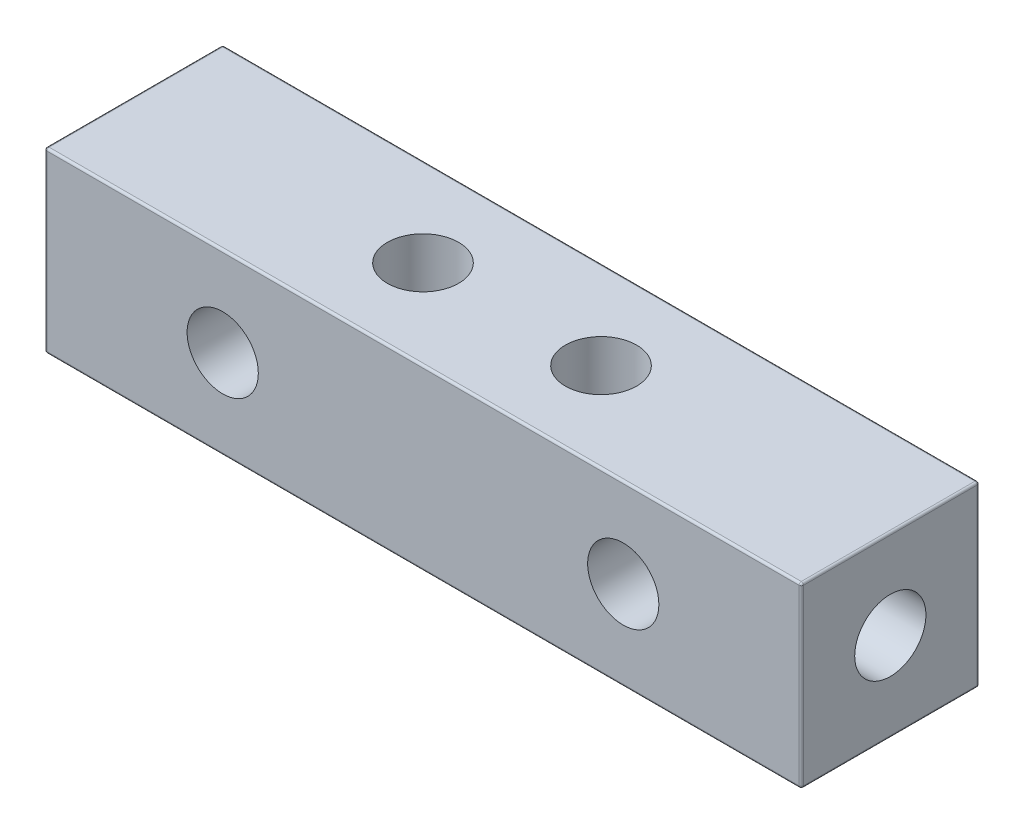
ISO-10303-21;
HEADER;
FILE_DESCRIPTION(('STEP AP214'),'2;1');
FILE_NAME('part.step','',(''),(''),'','','');
FILE_SCHEMA(('AUTOMOTIVE_DESIGN { 1 0 10303 214 1 1 1 1 }'));
ENDSEC;
DATA;
#1=APPLICATION_CONTEXT('core data for automotive mechanical design processes');
#2=APPLICATION_PROTOCOL_DEFINITION('international standard','automotive_design',2000,#1);
#3=PRODUCT_CONTEXT('',#1,'mechanical');
#4=PRODUCT('Part','Part','',(#3));
#5=PRODUCT_RELATED_PRODUCT_CATEGORY('part','',(#4));
#6=PRODUCT_DEFINITION_FORMATION('','',#4);
#7=PRODUCT_DEFINITION_CONTEXT('part definition',#1,'design');
#8=PRODUCT_DEFINITION('design','',#6,#7);
#9=PRODUCT_DEFINITION_SHAPE('','',#8);
#10=(LENGTH_UNIT() NAMED_UNIT(*) SI_UNIT(.MILLI.,.METRE.));
#11=(NAMED_UNIT(*) PLANE_ANGLE_UNIT() SI_UNIT($,.RADIAN.));
#12=(NAMED_UNIT(*) SI_UNIT($,.STERADIAN.) SOLID_ANGLE_UNIT());
#13=UNCERTAINTY_MEASURE_WITH_UNIT(LENGTH_MEASURE(1.E-05),#10,'distance_accuracy_value','');
#14=(GEOMETRIC_REPRESENTATION_CONTEXT(3) GLOBAL_UNCERTAINTY_ASSIGNED_CONTEXT((#13)) GLOBAL_UNIT_ASSIGNED_CONTEXT((#10,
#11,#12)) REPRESENTATION_CONTEXT('',''));
#15=CARTESIAN_POINT('',(0.,0.,0.));
#16=DIRECTION('',(0.,0.,1.));
#17=DIRECTION('',(1.,0.,0.));
#18=AXIS2_PLACEMENT_3D('',#15,#16,#17);
#19=CARTESIAN_POINT('',(34.,0.,0.));
#20=DIRECTION('',(-1.,0.,0.));
#21=DIRECTION('',(0.,0.,1.));
#22=AXIS2_PLACEMENT_3D('',#19,#20,#21);
#23=CYLINDRICAL_SURFACE('',#22,1.6);
#24=CARTESIAN_POINT('',(8.,0.,0.));
#25=DIRECTION('',(-0.707106781186547,0.,-0.707106781186547));
#26=DIRECTION('',(-0.707106781186547,0.,0.707106781186547));
#27=AXIS2_PLACEMENT_3D('',#24,#25,#26);
#28=ELLIPSE('',#27,2.26274169979695,1.6);
#29=CARTESIAN_POINT('',(8.,1.6,0.));
#30=VERTEX_POINT('',#29);
#31=CARTESIAN_POINT('',(8.,-1.6,0.));
#32=VERTEX_POINT('',#31);
#33=EDGE_CURVE('E239',#30,#32,#28,.T.);
#34=ORIENTED_EDGE('',*,*,#33,.T.);
#35=CARTESIAN_POINT('',(8.,0.,0.));
#36=DIRECTION('',(-0.707106781186547,0.,0.707106781186547));
#37=DIRECTION('',(-0.707106781186547,0.,-0.707106781186547));
#38=AXIS2_PLACEMENT_3D('',#35,#36,#37);
#39=ELLIPSE('',#38,2.26274169979695,1.6);
#40=EDGE_CURVE('E242',#32,#30,#39,.T.);
#41=ORIENTED_EDGE('',*,*,#40,.T.);
#42=EDGE_LOOP('',(#34,#41));
#43=FACE_BOUND('',#42,.T.);
#44=CARTESIAN_POINT('',(13.,0.,0.));
#45=DIRECTION('',(-0.707106781186547,-0.707106781186547,0.));
#46=DIRECTION('',(-0.707106781186547,0.707106781186547,0.));
#47=AXIS2_PLACEMENT_3D('',#44,#45,#46);
#48=ELLIPSE('',#47,2.26274169979695,1.6);
#49=CARTESIAN_POINT('',(13.,0.,-1.6));
#50=VERTEX_POINT('',#49);
#51=CARTESIAN_POINT('',(13.,0.,1.6));
#52=VERTEX_POINT('',#51);
#53=EDGE_CURVE('E60',#50,#52,#48,.F.);
#54=ORIENTED_EDGE('',*,*,#53,.T.);
#55=CARTESIAN_POINT('',(13.,0.,0.));
#56=DIRECTION('',(-0.707106781186547,0.707106781186547,0.));
#57=DIRECTION('',(-0.707106781186547,-0.707106781186547,0.));
#58=AXIS2_PLACEMENT_3D('',#55,#56,#57);
#59=ELLIPSE('',#58,2.26274169979695,1.6);
#60=EDGE_CURVE('E156',#52,#50,#59,.F.);
#61=ORIENTED_EDGE('',*,*,#60,.T.);
#62=EDGE_LOOP('',(#54,#61));
#63=FACE_BOUND('',#62,.T.);
#64=ADVANCED_FACE('F40',(#43,#63),#23,.F.);
#65=CARTESIAN_POINT('',(0.,0.,0.));
#66=DIRECTION('',(-1.,0.,0.));
#67=DIRECTION('',(0.,0.,1.));
#68=AXIS2_PLACEMENT_3D('',#65,#66,#67);
#69=CIRCLE('',#68,1.6);
#70=CARTESIAN_POINT('',(0.,0.,1.6));
#71=VERTEX_POINT('',#70);
#72=EDGE_CURVE('E231',#71,#71,#69,.T.);
#73=ORIENTED_EDGE('',*,*,#72,.T.);
#74=EDGE_LOOP('',(#73));
#75=FACE_BOUND('',#74,.T.);
#76=CARTESIAN_POINT('',(8.,0.,0.));
#77=DIRECTION('',(-0.707106781186547,0.,-0.707106781186547));
#78=DIRECTION('',(-0.707106781186547,0.,0.707106781186547));
#79=AXIS2_PLACEMENT_3D('',#76,#77,#78);
#80=ELLIPSE('',#79,2.26274169979695,1.6);
#81=EDGE_CURVE('E234',#30,#32,#80,.F.);
#82=ORIENTED_EDGE('',*,*,#81,.T.);
#83=CARTESIAN_POINT('',(8.,0.,0.));
#84=DIRECTION('',(-0.707106781186547,0.,0.707106781186547));
#85=DIRECTION('',(-0.707106781186547,0.,-0.707106781186547));
#86=AXIS2_PLACEMENT_3D('',#83,#84,#85);
#87=ELLIPSE('',#86,2.26274169979695,1.6);
#88=EDGE_CURVE('E163',#32,#30,#87,.F.);
#89=ORIENTED_EDGE('',*,*,#88,.T.);
#90=EDGE_LOOP('',(#82,#89));
#91=FACE_BOUND('',#90,.T.);
#92=ADVANCED_FACE('F194',(#75,#91),#23,.F.);
#93=CARTESIAN_POINT('',(34.,4.,-4.));
#94=DIRECTION('',(0.,0.,1.));
#95=DIRECTION('',(0.,-1.,0.));
#96=AXIS2_PLACEMENT_3D('',#93,#94,#95);
#97=PLANE('',#96);
#98=CARTESIAN_POINT('',(8.,0.,-4.));
#99=DIRECTION('',(0.,0.,1.));
#100=DIRECTION('',(1.,0.,0.));
#101=AXIS2_PLACEMENT_3D('',#98,#99,#100);
#102=CIRCLE('',#101,1.6);
#103=CARTESIAN_POINT('',(9.6,0.,-4.));
#104=VERTEX_POINT('',#103);
#105=EDGE_CURVE('E381',#104,#104,#102,.T.);
#106=ORIENTED_EDGE('',*,*,#105,.T.);
#107=EDGE_LOOP('',(#106));
#108=FACE_BOUND('',#107,.T.);
#109=CARTESIAN_POINT('',(26.,0.,-4.));
#110=DIRECTION('',(0.,0.,1.));
#111=DIRECTION('',(1.,0.,0.));
#112=AXIS2_PLACEMENT_3D('',#109,#110,#111);
#113=CIRCLE('',#112,1.6);
#114=CARTESIAN_POINT('',(27.6,0.,-4.));
#115=VERTEX_POINT('',#114);
#116=EDGE_CURVE('E384',#115,#115,#113,.T.);
#117=ORIENTED_EDGE('',*,*,#116,.T.);
#118=EDGE_LOOP('',(#117));
#119=FACE_BOUND('',#118,.T.);
#120=DIRECTION('',(0.,1.,0.));
#121=VECTOR('',#120,1.);
#122=CARTESIAN_POINT('',(33.9,-4.,-4.));
#123=LINE('',#122,#121);
#124=CARTESIAN_POINT('',(33.9,3.9,-4.));
#125=VERTEX_POINT('',#124);
#126=CARTESIAN_POINT('',(33.9,-3.9,-4.));
#127=VERTEX_POINT('',#126);
#128=EDGE_CURVE('E352',#125,#127,#123,.F.);
#129=ORIENTED_EDGE('',*,*,#128,.T.);
#130=DIRECTION('',(-1.,0.,0.));
#131=VECTOR('',#130,1.);
#132=CARTESIAN_POINT('',(34.,-3.9,-4.));
#133=LINE('',#132,#131);
#134=CARTESIAN_POINT('',(0.100000000000003,-3.9,-4.));
#135=VERTEX_POINT('',#134);
#136=EDGE_CURVE('E345',#127,#135,#133,.T.);
#137=ORIENTED_EDGE('',*,*,#136,.T.);
#138=DIRECTION('',(0.,1.,0.));
#139=VECTOR('',#138,1.);
#140=CARTESIAN_POINT('',(0.100000000000003,4.,-4.));
#141=LINE('',#140,#139);
#142=CARTESIAN_POINT('',(0.100000000000003,3.9,-4.));
#143=VERTEX_POINT('',#142);
#144=EDGE_CURVE('E348',#135,#143,#141,.T.);
#145=ORIENTED_EDGE('',*,*,#144,.T.);
#146=DIRECTION('',(-1.,0.,0.));
#147=VECTOR('',#146,1.);
#148=CARTESIAN_POINT('',(34.,3.9,-4.));
#149=LINE('',#148,#147);
#150=EDGE_CURVE('E350',#143,#125,#149,.F.);
#151=ORIENTED_EDGE('',*,*,#150,.T.);
#152=EDGE_LOOP('',(#129,#137,#145,#151));
#153=FACE_BOUND('',#152,.T.);
#154=ADVANCED_FACE('F220',(#108,#119,#153),#97,.F.);
#155=CARTESIAN_POINT('',(34.,4.,4.));
#156=DIRECTION('',(0.,-1.,0.));
#157=DIRECTION('',(0.,0.,-1.));
#158=AXIS2_PLACEMENT_3D('',#155,#156,#157);
#159=PLANE('',#158);
#160=CARTESIAN_POINT('',(21.,4.,0.));
#161=DIRECTION('',(0.,1.,0.));
#162=DIRECTION('',(0.,0.,1.));
#163=AXIS2_PLACEMENT_3D('',#160,#161,#162);
#164=CIRCLE('',#163,1.6);
#165=CARTESIAN_POINT('',(21.,4.,1.6));
#166=VERTEX_POINT('',#165);
#167=EDGE_CURVE('E402',#166,#166,#164,.T.);
#168=ORIENTED_EDGE('',*,*,#167,.F.);
#169=EDGE_LOOP('',(#168));
#170=FACE_BOUND('',#169,.T.);
#171=CARTESIAN_POINT('',(13.,4.,0.));
#172=DIRECTION('',(0.,1.,0.));
#173=DIRECTION('',(0.,0.,1.));
#174=AXIS2_PLACEMENT_3D('',#171,#172,#173);
#175=CIRCLE('',#174,1.6);
#176=CARTESIAN_POINT('',(13.,4.,1.6));
#177=VERTEX_POINT('',#176);
#178=EDGE_CURVE('E399',#177,#177,#175,.T.);
#179=ORIENTED_EDGE('',*,*,#178,.F.);
#180=EDGE_LOOP('',(#179));
#181=FACE_BOUND('',#180,.T.);
#182=DIRECTION('',(-1.,0.,0.));
#183=VECTOR('',#182,1.);
#184=CARTESIAN_POINT('',(34.,4.,-3.9));
#185=LINE('',#184,#183);
#186=CARTESIAN_POINT('',(33.9,4.,-3.9));
#187=VERTEX_POINT('',#186);
#188=CARTESIAN_POINT('',(0.100000000000003,4.,-3.9));
#189=VERTEX_POINT('',#188);
#190=EDGE_CURVE('E338',#187,#189,#185,.T.);
#191=ORIENTED_EDGE('',*,*,#190,.T.);
#192=DIRECTION('',(0.,0.,1.));
#193=VECTOR('',#192,1.);
#194=CARTESIAN_POINT('',(0.100000000000003,4.,4.));
#195=LINE('',#194,#193);
#196=CARTESIAN_POINT('',(0.100000000000003,4.,3.9));
#197=VERTEX_POINT('',#196);
#198=EDGE_CURVE('E336',#189,#197,#195,.T.);
#199=ORIENTED_EDGE('',*,*,#198,.T.);
#200=DIRECTION('',(-1.,0.,0.));
#201=VECTOR('',#200,1.);
#202=CARTESIAN_POINT('',(34.,4.,3.9));
#203=LINE('',#202,#201);
#204=CARTESIAN_POINT('',(33.9,4.,3.9));
#205=VERTEX_POINT('',#204);
#206=EDGE_CURVE('E341',#197,#205,#203,.F.);
#207=ORIENTED_EDGE('',*,*,#206,.T.);
#208=DIRECTION('',(0.,0.,1.));
#209=VECTOR('',#208,1.);
#210=CARTESIAN_POINT('',(33.9,4.,-4.));
#211=LINE('',#210,#209);
#212=EDGE_CURVE('E343',#205,#187,#211,.F.);
#213=ORIENTED_EDGE('',*,*,#212,.T.);
#214=EDGE_LOOP('',(#191,#199,#207,#213));
#215=FACE_BOUND('',#214,.T.);
#216=ADVANCED_FACE('F225',(#170,#181,#215),#159,.F.);
#217=CARTESIAN_POINT('',(34.,4.,4.));
#218=DIRECTION('',(0.,0.,-1.));
#219=DIRECTION('',(0.,1.,0.));
#220=AXIS2_PLACEMENT_3D('',#217,#218,#219);
#221=PLANE('',#220);
#222=CARTESIAN_POINT('',(8.,0.,4.));
#223=DIRECTION('',(0.,0.,1.));
#224=DIRECTION('',(1.,0.,0.));
#225=AXIS2_PLACEMENT_3D('',#222,#223,#224);
#226=CIRCLE('',#225,1.6);
#227=CARTESIAN_POINT('',(9.6,0.,4.));
#228=VERTEX_POINT('',#227);
#229=EDGE_CURVE('E391',#228,#228,#226,.T.);
#230=ORIENTED_EDGE('',*,*,#229,.F.);
#231=EDGE_LOOP('',(#230));
#232=FACE_BOUND('',#231,.T.);
#233=CARTESIAN_POINT('',(26.,0.,4.));
#234=DIRECTION('',(0.,0.,1.));
#235=DIRECTION('',(1.,0.,0.));
#236=AXIS2_PLACEMENT_3D('',#233,#234,#235);
#237=CIRCLE('',#236,1.6);
#238=CARTESIAN_POINT('',(27.6,0.,4.));
#239=VERTEX_POINT('',#238);
#240=EDGE_CURVE('E387',#239,#239,#237,.T.);
#241=ORIENTED_EDGE('',*,*,#240,.F.);
#242=EDGE_LOOP('',(#241));
#243=FACE_BOUND('',#242,.T.);
#244=DIRECTION('',(0.,-1.,0.));
#245=VECTOR('',#244,1.);
#246=CARTESIAN_POINT('',(0.100000000000003,4.,4.));
#247=LINE('',#246,#245);
#248=CARTESIAN_POINT('',(0.100000000000003,3.9,4.));
#249=VERTEX_POINT('',#248);
#250=CARTESIAN_POINT('',(0.100000000000003,-3.9,4.));
#251=VERTEX_POINT('',#250);
#252=EDGE_CURVE('E366',#249,#251,#247,.T.);
#253=ORIENTED_EDGE('',*,*,#252,.T.);
#254=DIRECTION('',(-1.,0.,0.));
#255=VECTOR('',#254,1.);
#256=CARTESIAN_POINT('',(34.,-3.9,4.));
#257=LINE('',#256,#255);
#258=CARTESIAN_POINT('',(33.9,-3.9,4.));
#259=VERTEX_POINT('',#258);
#260=EDGE_CURVE('E363',#251,#259,#257,.F.);
#261=ORIENTED_EDGE('',*,*,#260,.T.);
#262=DIRECTION('',(0.,-1.,0.));
#263=VECTOR('',#262,1.);
#264=CARTESIAN_POINT('',(33.9,4.,4.));
#265=LINE('',#264,#263);
#266=CARTESIAN_POINT('',(33.9,3.9,4.));
#267=VERTEX_POINT('',#266);
#268=EDGE_CURVE('E370',#259,#267,#265,.F.);
#269=ORIENTED_EDGE('',*,*,#268,.T.);
#270=DIRECTION('',(-1.,0.,0.));
#271=VECTOR('',#270,1.);
#272=CARTESIAN_POINT('',(34.,3.9,4.));
#273=LINE('',#272,#271);
#274=EDGE_CURVE('E368',#267,#249,#273,.T.);
#275=ORIENTED_EDGE('',*,*,#274,.T.);
#276=EDGE_LOOP('',(#253,#261,#269,#275));
#277=FACE_BOUND('',#276,.T.);
#278=ADVANCED_FACE('F568',(#232,#243,#277),#221,.F.);
#279=CARTESIAN_POINT('',(34.,-4.,4.));
#280=DIRECTION('',(0.,1.,0.));
#281=DIRECTION('',(0.,0.,1.));
#282=AXIS2_PLACEMENT_3D('',#279,#280,#281);
#283=PLANE('',#282);
#284=CARTESIAN_POINT('',(21.,-4.,0.));
#285=DIRECTION('',(0.,1.,0.));
#286=DIRECTION('',(0.,0.,1.));
#287=AXIS2_PLACEMENT_3D('',#284,#285,#286);
#288=CIRCLE('',#287,1.6);
#289=CARTESIAN_POINT('',(21.,-4.,1.6));
#290=VERTEX_POINT('',#289);
#291=EDGE_CURVE('E388',#290,#290,#288,.T.);
#292=ORIENTED_EDGE('',*,*,#291,.T.);
#293=EDGE_LOOP('',(#292));
#294=FACE_BOUND('',#293,.T.);
#295=CARTESIAN_POINT('',(13.,-4.,0.));
#296=DIRECTION('',(0.,1.,0.));
#297=DIRECTION('',(0.,0.,1.));
#298=AXIS2_PLACEMENT_3D('',#295,#296,#297);
#299=CIRCLE('',#298,1.6);
#300=CARTESIAN_POINT('',(13.,-4.,1.6));
#301=VERTEX_POINT('',#300);
#302=EDGE_CURVE('E396',#301,#301,#299,.T.);
#303=ORIENTED_EDGE('',*,*,#302,.T.);
#304=EDGE_LOOP('',(#303));
#305=FACE_BOUND('',#304,.T.);
#306=DIRECTION('',(-1.,0.,0.));
#307=VECTOR('',#306,1.);
#308=CARTESIAN_POINT('',(34.,-4.,-3.9));
#309=LINE('',#308,#307);
#310=CARTESIAN_POINT('',(0.100000000000003,-4.,-3.9));
#311=VERTEX_POINT('',#310);
#312=CARTESIAN_POINT('',(33.9,-4.,-3.9));
#313=VERTEX_POINT('',#312);
#314=EDGE_CURVE('E377',#311,#313,#309,.F.);
#315=ORIENTED_EDGE('',*,*,#314,.T.);
#316=DIRECTION('',(0.,0.,-1.));
#317=VECTOR('',#316,1.);
#318=CARTESIAN_POINT('',(33.9,-4.,4.));
#319=LINE('',#318,#317);
#320=CARTESIAN_POINT('',(33.9,-4.,3.9));
#321=VERTEX_POINT('',#320);
#322=EDGE_CURVE('E372',#313,#321,#319,.F.);
#323=ORIENTED_EDGE('',*,*,#322,.T.);
#324=DIRECTION('',(-1.,0.,0.));
#325=VECTOR('',#324,1.);
#326=CARTESIAN_POINT('',(34.,-4.,3.9));
#327=LINE('',#326,#325);
#328=CARTESIAN_POINT('',(0.100000000000003,-4.,3.9));
#329=VERTEX_POINT('',#328);
#330=EDGE_CURVE('E374',#321,#329,#327,.T.);
#331=ORIENTED_EDGE('',*,*,#330,.T.);
#332=DIRECTION('',(0.,0.,-1.));
#333=VECTOR('',#332,1.);
#334=CARTESIAN_POINT('',(0.100000000000003,-4.,4.));
#335=LINE('',#334,#333);
#336=EDGE_CURVE('E262',#329,#311,#335,.T.);
#337=ORIENTED_EDGE('',*,*,#336,.T.);
#338=EDGE_LOOP('',(#315,#323,#331,#337));
#339=FACE_BOUND('',#338,.T.);
#340=ADVANCED_FACE('F408',(#294,#305,#339),#283,.F.);
#341=CARTESIAN_POINT('',(34.,0.,0.));
#342=DIRECTION('',(1.,0.,0.));
#343=DIRECTION('',(0.,0.,-1.));
#344=AXIS2_PLACEMENT_3D('',#341,#342,#343);
#345=PLANE('',#344);
#346=CARTESIAN_POINT('',(34.,0.,0.));
#347=DIRECTION('',(-1.,0.,0.));
#348=DIRECTION('',(0.,0.,1.));
#349=AXIS2_PLACEMENT_3D('',#346,#347,#348);
#350=CIRCLE('',#349,1.6);
#351=CARTESIAN_POINT('',(34.,0.,1.6));
#352=VERTEX_POINT('',#351);
#353=EDGE_CURVE('E327',#352,#352,#350,.T.);
#354=ORIENTED_EDGE('',*,*,#353,.T.);
#355=EDGE_LOOP('',(#354));
#356=FACE_BOUND('',#355,.T.);
#357=DIRECTION('',(0.,-1.,0.));
#358=VECTOR('',#357,1.);
#359=CARTESIAN_POINT('',(34.,-4.,3.9));
#360=LINE('',#359,#358);
#361=CARTESIAN_POINT('',(34.,3.9,3.9));
#362=VERTEX_POINT('',#361);
#363=CARTESIAN_POINT('',(34.,-3.9,3.9));
#364=VERTEX_POINT('',#363);
#365=EDGE_CURVE('E330',#362,#364,#360,.T.);
#366=ORIENTED_EDGE('',*,*,#365,.T.);
#367=DIRECTION('',(0.,0.,-1.));
#368=VECTOR('',#367,1.);
#369=CARTESIAN_POINT('',(34.,-3.9,-4.));
#370=LINE('',#369,#368);
#371=CARTESIAN_POINT('',(34.,-3.9,-3.9));
#372=VERTEX_POINT('',#371);
#373=EDGE_CURVE('E258',#364,#372,#370,.T.);
#374=ORIENTED_EDGE('',*,*,#373,.T.);
#375=DIRECTION('',(0.,1.,0.));
#376=VECTOR('',#375,1.);
#377=CARTESIAN_POINT('',(34.,4.,-3.9));
#378=LINE('',#377,#376);
#379=CARTESIAN_POINT('',(34.,3.9,-3.9));
#380=VERTEX_POINT('',#379);
#381=EDGE_CURVE('E334',#372,#380,#378,.T.);
#382=ORIENTED_EDGE('',*,*,#381,.T.);
#383=DIRECTION('',(0.,0.,1.));
#384=VECTOR('',#383,1.);
#385=CARTESIAN_POINT('',(34.,3.9,4.));
#386=LINE('',#385,#384);
#387=EDGE_CURVE('E332',#380,#362,#386,.T.);
#388=ORIENTED_EDGE('',*,*,#387,.T.);
#389=EDGE_LOOP('',(#366,#374,#382,#388));
#390=FACE_BOUND('',#389,.T.);
#391=ADVANCED_FACE('F502',(#356,#390),#345,.T.);
#392=CARTESIAN_POINT('',(0.,0.,0.));
#393=DIRECTION('',(1.,0.,0.));
#394=DIRECTION('',(0.,0.,-1.));
#395=AXIS2_PLACEMENT_3D('',#392,#393,#394);
#396=PLANE('',#395);
#397=ORIENTED_EDGE('',*,*,#72,.F.);
#398=EDGE_LOOP('',(#397));
#399=FACE_BOUND('',#398,.T.);
#400=DIRECTION('',(0.,-1.,0.));
#401=VECTOR('',#400,1.);
#402=CARTESIAN_POINT('',(0.,0.,3.9));
#403=LINE('',#402,#401);
#404=CARTESIAN_POINT('',(0.,-3.9,3.9));
#405=VERTEX_POINT('',#404);
#406=CARTESIAN_POINT('',(0.,3.9,3.9));
#407=VERTEX_POINT('',#406);
#408=EDGE_CURVE('E356',#405,#407,#403,.F.);
#409=ORIENTED_EDGE('',*,*,#408,.T.);
#410=DIRECTION('',(0.,0.,1.));
#411=VECTOR('',#410,1.);
#412=CARTESIAN_POINT('',(0.,3.9,0.));
#413=LINE('',#412,#411);
#414=CARTESIAN_POINT('',(0.,3.9,-3.9));
#415=VERTEX_POINT('',#414);
#416=EDGE_CURVE('E354',#407,#415,#413,.F.);
#417=ORIENTED_EDGE('',*,*,#416,.T.);
#418=DIRECTION('',(0.,1.,0.));
#419=VECTOR('',#418,1.);
#420=CARTESIAN_POINT('',(0.,0.,-3.9));
#421=LINE('',#420,#419);
#422=CARTESIAN_POINT('',(0.,-3.9,-3.9));
#423=VERTEX_POINT('',#422);
#424=EDGE_CURVE('E359',#415,#423,#421,.F.);
#425=ORIENTED_EDGE('',*,*,#424,.T.);
#426=DIRECTION('',(0.,0.,-1.));
#427=VECTOR('',#426,1.);
#428=CARTESIAN_POINT('',(0.,-3.9,0.));
#429=LINE('',#428,#427);
#430=EDGE_CURVE('E361',#423,#405,#429,.F.);
#431=ORIENTED_EDGE('',*,*,#430,.T.);
#432=EDGE_LOOP('',(#409,#417,#425,#431));
#433=FACE_BOUND('',#432,.T.);
#434=ADVANCED_FACE('F467',(#399,#433),#396,.F.);
#435=CARTESIAN_POINT('',(34.,3.9,-3.9));
#436=DIRECTION('',(-1.,0.,0.));
#437=DIRECTION('',(0.,0.,1.));
#438=AXIS2_PLACEMENT_3D('',#435,#436,#437);
#439=CYLINDRICAL_SURFACE('',#438,0.1);
#440=CARTESIAN_POINT('',(33.9,3.9,-3.9));
#441=DIRECTION('',(1.,0.,0.));
#442=DIRECTION('',(0.,0.,-1.));
#443=AXIS2_PLACEMENT_3D('',#440,#441,#442);
#444=CIRCLE('',#443,0.1);
#445=EDGE_CURVE('E259',#125,#187,#444,.T.);
#446=ORIENTED_EDGE('',*,*,#445,.F.);
#447=ORIENTED_EDGE('',*,*,#150,.F.);
#448=CARTESIAN_POINT('',(0.100000000000003,3.9,-3.9));
#449=DIRECTION('',(-1.,0.,0.));
#450=DIRECTION('',(0.,0.,1.));
#451=AXIS2_PLACEMENT_3D('',#448,#449,#450);
#452=CIRCLE('',#451,0.1);
#453=EDGE_CURVE('E263',#189,#143,#452,.T.);
#454=ORIENTED_EDGE('',*,*,#453,.F.);
#455=ORIENTED_EDGE('',*,*,#190,.F.);
#456=EDGE_LOOP('',(#446,#447,#454,#455));
#457=FACE_BOUND('',#456,.T.);
#458=ADVANCED_FACE('F42',(#457),#439,.T.);
#459=CARTESIAN_POINT('',(33.9,3.9,-3.9));
#460=DIRECTION('',(0.,1.,0.));
#461=DIRECTION('',(0.,0.,1.));
#462=AXIS2_PLACEMENT_3D('',#459,#460,#461);
#463=SPHERICAL_SURFACE('',#462,0.1);
#464=CARTESIAN_POINT('',(33.9,3.9,-3.9));
#465=DIRECTION('',(0.,1.,0.));
#466=DIRECTION('',(0.,0.,1.));
#467=AXIS2_PLACEMENT_3D('',#464,#465,#466);
#468=CIRCLE('',#467,0.1);
#469=EDGE_CURVE('E269',#125,#380,#468,.F.);
#470=ORIENTED_EDGE('',*,*,#469,.F.);
#471=ORIENTED_EDGE('',*,*,#445,.T.);
#472=CARTESIAN_POINT('',(33.9,3.9,-3.9));
#473=DIRECTION('',(0.,0.,-1.));
#474=DIRECTION('',(-1.,0.,0.));
#475=AXIS2_PLACEMENT_3D('',#472,#473,#474);
#476=CIRCLE('',#475,0.1);
#477=EDGE_CURVE('E266',#380,#187,#476,.F.);
#478=ORIENTED_EDGE('',*,*,#477,.F.);
#479=EDGE_LOOP('',(#470,#471,#478));
#480=FACE_BOUND('',#479,.T.);
#481=ADVANCED_FACE('F494',(#480),#463,.T.);
#482=CARTESIAN_POINT('',(0.1,3.9,-3.9));
#483=DIRECTION('',(0.,0.,-1.));
#484=DIRECTION('',(-1.,0.,0.));
#485=AXIS2_PLACEMENT_3D('',#482,#483,#484);
#486=SPHERICAL_SURFACE('',#485,0.1);
#487=CARTESIAN_POINT('',(0.1,3.9,-3.9));
#488=DIRECTION('',(0.,0.,-1.));
#489=DIRECTION('',(0.,1.,0.));
#490=AXIS2_PLACEMENT_3D('',#487,#488,#489);
#491=CIRCLE('',#490,0.1);
#492=EDGE_CURVE('E275',#189,#415,#491,.F.);
#493=ORIENTED_EDGE('',*,*,#492,.F.);
#494=ORIENTED_EDGE('',*,*,#453,.T.);
#495=CARTESIAN_POINT('',(0.100000000000003,3.9,-3.9));
#496=DIRECTION('',(0.,1.,0.));
#497=DIRECTION('',(0.,0.,1.));
#498=AXIS2_PLACEMENT_3D('',#495,#496,#497);
#499=CIRCLE('',#498,0.1);
#500=EDGE_CURVE('E272',#415,#143,#499,.F.);
#501=ORIENTED_EDGE('',*,*,#500,.F.);
#502=EDGE_LOOP('',(#493,#494,#501));
#503=FACE_BOUND('',#502,.T.);
#504=ADVANCED_FACE('F486',(#503),#486,.T.);
#505=CARTESIAN_POINT('',(33.9,3.9,0.));
#506=DIRECTION('',(0.,0.,-1.));
#507=DIRECTION('',(-1.,0.,0.));
#508=AXIS2_PLACEMENT_3D('',#505,#506,#507);
#509=CYLINDRICAL_SURFACE('',#508,0.1);
#510=ORIENTED_EDGE('',*,*,#477,.T.);
#511=ORIENTED_EDGE('',*,*,#212,.F.);
#512=CARTESIAN_POINT('',(33.9,3.9,3.9));
#513=DIRECTION('',(0.,0.,1.));
#514=DIRECTION('',(1.,0.,0.));
#515=AXIS2_PLACEMENT_3D('',#512,#513,#514);
#516=CIRCLE('',#515,0.1);
#517=EDGE_CURVE('E281',#362,#205,#516,.T.);
#518=ORIENTED_EDGE('',*,*,#517,.F.);
#519=ORIENTED_EDGE('',*,*,#387,.F.);
#520=EDGE_LOOP('',(#510,#511,#518,#519));
#521=FACE_BOUND('',#520,.T.);
#522=ADVANCED_FACE('F499',(#521),#509,.T.);
#523=CARTESIAN_POINT('',(33.9,0.,-3.9));
#524=DIRECTION('',(0.,-1.,0.));
#525=DIRECTION('',(0.,0.,-1.));
#526=AXIS2_PLACEMENT_3D('',#523,#524,#525);
#527=CYLINDRICAL_SURFACE('',#526,0.1);
#528=ORIENTED_EDGE('',*,*,#469,.T.);
#529=ORIENTED_EDGE('',*,*,#381,.F.);
#530=CARTESIAN_POINT('',(33.9,-3.9,-3.9));
#531=DIRECTION('',(0.,-1.,0.));
#532=DIRECTION('',(1.,0.,0.));
#533=AXIS2_PLACEMENT_3D('',#530,#531,#532);
#534=CIRCLE('',#533,0.1);
#535=EDGE_CURVE('E284',#127,#372,#534,.T.);
#536=ORIENTED_EDGE('',*,*,#535,.F.);
#537=ORIENTED_EDGE('',*,*,#128,.F.);
#538=EDGE_LOOP('',(#528,#529,#536,#537));
#539=FACE_BOUND('',#538,.T.);
#540=ADVANCED_FACE('F445',(#539),#527,.T.);
#541=CARTESIAN_POINT('',(34.,-3.9,-3.9));
#542=DIRECTION('',(-1.,0.,0.));
#543=DIRECTION('',(0.,0.,1.));
#544=AXIS2_PLACEMENT_3D('',#541,#542,#543);
#545=CYLINDRICAL_SURFACE('',#544,0.1);
#546=CARTESIAN_POINT('',(0.100000000000003,-3.9,-3.9));
#547=DIRECTION('',(-1.,0.,0.));
#548=DIRECTION('',(0.,0.,1.));
#549=AXIS2_PLACEMENT_3D('',#546,#547,#548);
#550=CIRCLE('',#549,0.1);
#551=EDGE_CURVE('E290',#135,#311,#550,.T.);
#552=ORIENTED_EDGE('',*,*,#551,.F.);
#553=ORIENTED_EDGE('',*,*,#136,.F.);
#554=CARTESIAN_POINT('',(33.9,-3.9,-3.9));
#555=DIRECTION('',(1.,0.,0.));
#556=DIRECTION('',(0.,0.,-1.));
#557=AXIS2_PLACEMENT_3D('',#554,#555,#556);
#558=CIRCLE('',#557,0.1);
#559=EDGE_CURVE('E287',#313,#127,#558,.T.);
#560=ORIENTED_EDGE('',*,*,#559,.F.);
#561=ORIENTED_EDGE('',*,*,#314,.F.);
#562=EDGE_LOOP('',(#552,#553,#560,#561));
#563=FACE_BOUND('',#562,.T.);
#564=ADVANCED_FACE('F440',(#563),#545,.T.);
#565=CARTESIAN_POINT('',(0.100000000000003,4.,-3.9));
#566=DIRECTION('',(0.,1.,0.));
#567=DIRECTION('',(0.,0.,1.));
#568=AXIS2_PLACEMENT_3D('',#565,#566,#567);
#569=CYLINDRICAL_SURFACE('',#568,0.1);
#570=ORIENTED_EDGE('',*,*,#500,.T.);
#571=ORIENTED_EDGE('',*,*,#144,.F.);
#572=CARTESIAN_POINT('',(0.1,-3.9,-3.9));
#573=DIRECTION('',(0.,-1.,0.));
#574=DIRECTION('',(0.,0.,-1.));
#575=AXIS2_PLACEMENT_3D('',#572,#573,#574);
#576=CIRCLE('',#575,0.1);
#577=EDGE_CURVE('E293',#423,#135,#576,.T.);
#578=ORIENTED_EDGE('',*,*,#577,.F.);
#579=ORIENTED_EDGE('',*,*,#424,.F.);
#580=EDGE_LOOP('',(#570,#571,#578,#579));
#581=FACE_BOUND('',#580,.T.);
#582=ADVANCED_FACE('F488',(#581),#569,.T.);
#583=CARTESIAN_POINT('',(0.100000000000003,3.9,4.));
#584=DIRECTION('',(0.,0.,1.));
#585=DIRECTION('',(1.,0.,0.));
#586=AXIS2_PLACEMENT_3D('',#583,#584,#585);
#587=CYLINDRICAL_SURFACE('',#586,0.1);
#588=ORIENTED_EDGE('',*,*,#492,.T.);
#589=ORIENTED_EDGE('',*,*,#416,.F.);
#590=CARTESIAN_POINT('',(0.100000000000003,3.9,3.9));
#591=DIRECTION('',(0.,0.,1.));
#592=DIRECTION('',(1.,0.,0.));
#593=AXIS2_PLACEMENT_3D('',#590,#591,#592);
#594=CIRCLE('',#593,0.1);
#595=EDGE_CURVE('E295',#197,#407,#594,.T.);
#596=ORIENTED_EDGE('',*,*,#595,.F.);
#597=ORIENTED_EDGE('',*,*,#198,.F.);
#598=EDGE_LOOP('',(#588,#589,#596,#597));
#599=FACE_BOUND('',#598,.T.);
#600=ADVANCED_FACE('F481',(#599),#587,.T.);
#601=CARTESIAN_POINT('',(34.,3.9,3.9));
#602=DIRECTION('',(-1.,0.,0.));
#603=DIRECTION('',(0.,0.,1.));
#604=AXIS2_PLACEMENT_3D('',#601,#602,#603);
#605=CYLINDRICAL_SURFACE('',#604,0.1);
#606=CARTESIAN_POINT('',(33.9,3.9,3.9));
#607=DIRECTION('',(1.,0.,0.));
#608=DIRECTION('',(0.,0.,-1.));
#609=AXIS2_PLACEMENT_3D('',#606,#607,#608);
#610=CIRCLE('',#609,0.1);
#611=EDGE_CURVE('E278',#205,#267,#610,.T.);
#612=ORIENTED_EDGE('',*,*,#611,.F.);
#613=ORIENTED_EDGE('',*,*,#206,.F.);
#614=CARTESIAN_POINT('',(0.100000000000003,3.9,3.9));
#615=DIRECTION('',(-1.,0.,0.));
#616=DIRECTION('',(0.,0.,1.));
#617=AXIS2_PLACEMENT_3D('',#614,#615,#616);
#618=CIRCLE('',#617,0.1);
#619=EDGE_CURVE('E298',#249,#197,#618,.T.);
#620=ORIENTED_EDGE('',*,*,#619,.F.);
#621=ORIENTED_EDGE('',*,*,#274,.F.);
#622=EDGE_LOOP('',(#612,#613,#620,#621));
#623=FACE_BOUND('',#622,.T.);
#624=ADVANCED_FACE('F536',(#623),#605,.T.);
#625=CARTESIAN_POINT('',(33.9,3.9,3.9));
#626=DIRECTION('',(0.,1.,0.));
#627=DIRECTION('',(0.,0.,1.));
#628=AXIS2_PLACEMENT_3D('',#625,#626,#627);
#629=SPHERICAL_SURFACE('',#628,0.1);
#630=ORIENTED_EDGE('',*,*,#517,.T.);
#631=ORIENTED_EDGE('',*,*,#611,.T.);
#632=CARTESIAN_POINT('',(33.9,3.9,3.9));
#633=DIRECTION('',(0.,1.,0.));
#634=DIRECTION('',(0.,0.,1.));
#635=AXIS2_PLACEMENT_3D('',#632,#633,#634);
#636=CIRCLE('',#635,0.1);
#637=EDGE_CURVE('E301',#362,#267,#636,.F.);
#638=ORIENTED_EDGE('',*,*,#637,.F.);
#639=EDGE_LOOP('',(#630,#631,#638));
#640=FACE_BOUND('',#639,.T.);
#641=ADVANCED_FACE('F533',(#640),#629,.T.);
#642=CARTESIAN_POINT('',(33.9,-3.9,-3.9));
#643=DIRECTION('',(0.,0.,-1.));
#644=DIRECTION('',(0.,1.,0.));
#645=AXIS2_PLACEMENT_3D('',#642,#643,#644);
#646=SPHERICAL_SURFACE('',#645,0.1);
#647=ORIENTED_EDGE('',*,*,#559,.T.);
#648=ORIENTED_EDGE('',*,*,#535,.T.);
#649=CARTESIAN_POINT('',(33.9,-3.9,-3.9));
#650=DIRECTION('',(0.,0.,-1.));
#651=DIRECTION('',(-1.,0.,0.));
#652=AXIS2_PLACEMENT_3D('',#649,#650,#651);
#653=CIRCLE('',#652,0.1);
#654=EDGE_CURVE('E304',#313,#372,#653,.F.);
#655=ORIENTED_EDGE('',*,*,#654,.F.);
#656=EDGE_LOOP('',(#647,#648,#655));
#657=FACE_BOUND('',#656,.T.);
#658=ADVANCED_FACE('F447',(#657),#646,.T.);
#659=CARTESIAN_POINT('',(0.1,-3.9,-3.9));
#660=DIRECTION('',(0.,0.,-1.));
#661=DIRECTION('',(-1.,0.,0.));
#662=AXIS2_PLACEMENT_3D('',#659,#660,#661);
#663=SPHERICAL_SURFACE('',#662,0.1);
#664=ORIENTED_EDGE('',*,*,#577,.T.);
#665=ORIENTED_EDGE('',*,*,#551,.T.);
#666=CARTESIAN_POINT('',(0.100000000000003,-3.9,-3.9));
#667=DIRECTION('',(0.,0.,-1.));
#668=DIRECTION('',(-1.,0.,0.));
#669=AXIS2_PLACEMENT_3D('',#666,#667,#668);
#670=CIRCLE('',#669,0.1);
#671=EDGE_CURVE('E306',#423,#311,#670,.F.);
#672=ORIENTED_EDGE('',*,*,#671,.F.);
#673=EDGE_LOOP('',(#664,#665,#672));
#674=FACE_BOUND('',#673,.T.);
#675=ADVANCED_FACE('F459',(#674),#663,.T.);
#676=CARTESIAN_POINT('',(0.1,3.9,3.9));
#677=DIRECTION('',(0.,1.,0.));
#678=DIRECTION('',(-1.,0.,0.));
#679=AXIS2_PLACEMENT_3D('',#676,#677,#678);
#680=SPHERICAL_SURFACE('',#679,0.1);
#681=ORIENTED_EDGE('',*,*,#619,.T.);
#682=ORIENTED_EDGE('',*,*,#595,.T.);
#683=CARTESIAN_POINT('',(0.1,3.9,3.9));
#684=DIRECTION('',(0.,1.,0.));
#685=DIRECTION('',(0.,0.,1.));
#686=AXIS2_PLACEMENT_3D('',#683,#684,#685);
#687=CIRCLE('',#686,0.1);
#688=EDGE_CURVE('E309',#249,#407,#687,.F.);
#689=ORIENTED_EDGE('',*,*,#688,.F.);
#690=EDGE_LOOP('',(#681,#682,#689));
#691=FACE_BOUND('',#690,.T.);
#692=ADVANCED_FACE('F478',(#691),#680,.T.);
#693=CARTESIAN_POINT('',(33.9,0.,3.9));
#694=DIRECTION('',(0.,1.,0.));
#695=DIRECTION('',(0.,0.,1.));
#696=AXIS2_PLACEMENT_3D('',#693,#694,#695);
#697=CYLINDRICAL_SURFACE('',#696,0.1);
#698=ORIENTED_EDGE('',*,*,#637,.T.);
#699=ORIENTED_EDGE('',*,*,#268,.F.);
#700=CARTESIAN_POINT('',(33.9,-3.9,3.9));
#701=DIRECTION('',(0.,-1.,0.));
#702=DIRECTION('',(0.,0.,-1.));
#703=AXIS2_PLACEMENT_3D('',#700,#701,#702);
#704=CIRCLE('',#703,0.1);
#705=EDGE_CURVE('E311',#364,#259,#704,.T.);
#706=ORIENTED_EDGE('',*,*,#705,.F.);
#707=ORIENTED_EDGE('',*,*,#365,.F.);
#708=EDGE_LOOP('',(#698,#699,#706,#707));
#709=FACE_BOUND('',#708,.T.);
#710=ADVANCED_FACE('F507',(#709),#697,.T.);
#711=CARTESIAN_POINT('',(33.9,-3.9,0.));
#712=DIRECTION('',(0.,0.,1.));
#713=DIRECTION('',(1.,0.,0.));
#714=AXIS2_PLACEMENT_3D('',#711,#712,#713);
#715=CYLINDRICAL_SURFACE('',#714,0.1);
#716=ORIENTED_EDGE('',*,*,#654,.T.);
#717=ORIENTED_EDGE('',*,*,#373,.F.);
#718=CARTESIAN_POINT('',(33.9,-3.9,3.9));
#719=DIRECTION('',(0.,0.,1.));
#720=DIRECTION('',(1.,0.,0.));
#721=AXIS2_PLACEMENT_3D('',#718,#719,#720);
#722=CIRCLE('',#721,0.1);
#723=EDGE_CURVE('E314',#321,#364,#722,.T.);
#724=ORIENTED_EDGE('',*,*,#723,.F.);
#725=ORIENTED_EDGE('',*,*,#322,.F.);
#726=EDGE_LOOP('',(#716,#717,#724,#725));
#727=FACE_BOUND('',#726,.T.);
#728=ADVANCED_FACE('F452',(#727),#715,.T.);
#729=CARTESIAN_POINT('',(0.100000000000003,-3.9,4.));
#730=DIRECTION('',(0.,0.,-1.));
#731=DIRECTION('',(-1.,0.,0.));
#732=AXIS2_PLACEMENT_3D('',#729,#730,#731);
#733=CYLINDRICAL_SURFACE('',#732,0.1);
#734=ORIENTED_EDGE('',*,*,#671,.T.);
#735=ORIENTED_EDGE('',*,*,#336,.F.);
#736=CARTESIAN_POINT('',(0.1,-3.9,3.9));
#737=DIRECTION('',(0.,0.,1.));
#738=DIRECTION('',(1.,0.,0.));
#739=AXIS2_PLACEMENT_3D('',#736,#737,#738);
#740=CIRCLE('',#739,0.1);
#741=EDGE_CURVE('E317',#405,#329,#740,.T.);
#742=ORIENTED_EDGE('',*,*,#741,.F.);
#743=ORIENTED_EDGE('',*,*,#430,.F.);
#744=EDGE_LOOP('',(#734,#735,#742,#743));
#745=FACE_BOUND('',#744,.T.);
#746=ADVANCED_FACE('F463',(#745),#733,.T.);
#747=CARTESIAN_POINT('',(0.100000000000003,4.,3.9));
#748=DIRECTION('',(0.,-1.,0.));
#749=DIRECTION('',(0.,0.,-1.));
#750=AXIS2_PLACEMENT_3D('',#747,#748,#749);
#751=CYLINDRICAL_SURFACE('',#750,0.1);
#752=ORIENTED_EDGE('',*,*,#688,.T.);
#753=ORIENTED_EDGE('',*,*,#408,.F.);
#754=CARTESIAN_POINT('',(0.100000000000003,-3.9,3.9));
#755=DIRECTION('',(0.,-1.,0.));
#756=DIRECTION('',(0.,0.,-1.));
#757=AXIS2_PLACEMENT_3D('',#754,#755,#756);
#758=CIRCLE('',#757,0.1);
#759=EDGE_CURVE('E320',#251,#405,#758,.T.);
#760=ORIENTED_EDGE('',*,*,#759,.F.);
#761=ORIENTED_EDGE('',*,*,#252,.F.);
#762=EDGE_LOOP('',(#752,#753,#760,#761));
#763=FACE_BOUND('',#762,.T.);
#764=ADVANCED_FACE('F471',(#763),#751,.T.);
#765=CARTESIAN_POINT('',(33.9,-3.9,3.9));
#766=DIRECTION('',(1.,0.,0.));
#767=DIRECTION('',(0.,0.,-1.));
#768=AXIS2_PLACEMENT_3D('',#765,#766,#767);
#769=SPHERICAL_SURFACE('',#768,0.1);
#770=ORIENTED_EDGE('',*,*,#723,.T.);
#771=ORIENTED_EDGE('',*,*,#705,.T.);
#772=CARTESIAN_POINT('',(33.9,-3.9,3.9));
#773=DIRECTION('',(1.,0.,0.));
#774=DIRECTION('',(0.,0.,-1.));
#775=AXIS2_PLACEMENT_3D('',#772,#773,#774);
#776=CIRCLE('',#775,0.1);
#777=EDGE_CURVE('E323',#321,#259,#776,.F.);
#778=ORIENTED_EDGE('',*,*,#777,.F.);
#779=EDGE_LOOP('',(#770,#771,#778));
#780=FACE_BOUND('',#779,.T.);
#781=ADVANCED_FACE('F509',(#780),#769,.T.);
#782=CARTESIAN_POINT('',(0.1,-3.9,3.9));
#783=DIRECTION('',(-1.,0.,0.));
#784=DIRECTION('',(0.,0.,1.));
#785=AXIS2_PLACEMENT_3D('',#782,#783,#784);
#786=SPHERICAL_SURFACE('',#785,0.1);
#787=ORIENTED_EDGE('',*,*,#759,.T.);
#788=ORIENTED_EDGE('',*,*,#741,.T.);
#789=CARTESIAN_POINT('',(0.100000000000003,-3.9,3.9));
#790=DIRECTION('',(-1.,0.,0.));
#791=DIRECTION('',(0.,0.,1.));
#792=AXIS2_PLACEMENT_3D('',#789,#790,#791);
#793=CIRCLE('',#792,0.1);
#794=EDGE_CURVE('E325',#251,#329,#793,.F.);
#795=ORIENTED_EDGE('',*,*,#794,.F.);
#796=EDGE_LOOP('',(#787,#788,#795));
#797=FACE_BOUND('',#796,.T.);
#798=ADVANCED_FACE('F206',(#797),#786,.T.);
#799=CARTESIAN_POINT('',(34.,-3.9,3.9));
#800=DIRECTION('',(-1.,0.,0.));
#801=DIRECTION('',(0.,0.,1.));
#802=AXIS2_PLACEMENT_3D('',#799,#800,#801);
#803=CYLINDRICAL_SURFACE('',#802,0.1);
#804=ORIENTED_EDGE('',*,*,#777,.T.);
#805=ORIENTED_EDGE('',*,*,#260,.F.);
#806=ORIENTED_EDGE('',*,*,#794,.T.);
#807=ORIENTED_EDGE('',*,*,#330,.F.);
#808=EDGE_LOOP('',(#804,#805,#806,#807));
#809=FACE_BOUND('',#808,.T.);
#810=ADVANCED_FACE('F198',(#809),#803,.T.);
#811=CARTESIAN_POINT('',(26.,0.,0.));
#812=DIRECTION('',(-0.707106781186547,0.,-0.707106781186547));
#813=DIRECTION('',(-0.707106781186547,0.,0.707106781186547));
#814=AXIS2_PLACEMENT_3D('',#811,#812,#813);
#815=ELLIPSE('',#814,2.26274169979695,1.6);
#816=CARTESIAN_POINT('',(26.,1.6,0.));
#817=VERTEX_POINT('',#816);
#818=CARTESIAN_POINT('',(26.,-1.6,0.));
#819=VERTEX_POINT('',#818);
#820=EDGE_CURVE('E254',#817,#819,#815,.T.);
#821=ORIENTED_EDGE('',*,*,#820,.T.);
#822=CARTESIAN_POINT('',(26.,0.,0.));
#823=DIRECTION('',(-0.707106781186547,0.,0.707106781186547));
#824=DIRECTION('',(-0.707106781186547,0.,-0.707106781186547));
#825=AXIS2_PLACEMENT_3D('',#822,#823,#824);
#826=ELLIPSE('',#825,2.26274169979695,1.6);
#827=EDGE_CURVE('E251',#819,#817,#826,.T.);
#828=ORIENTED_EDGE('',*,*,#827,.T.);
#829=EDGE_LOOP('',(#821,#828));
#830=FACE_BOUND('',#829,.T.);
#831=ORIENTED_EDGE('',*,*,#353,.F.);
#832=EDGE_LOOP('',(#831));
#833=FACE_BOUND('',#832,.T.);
#834=ADVANCED_FACE('F183',(#830,#833),#23,.F.);
#835=CARTESIAN_POINT('',(26.,0.,-4.));
#836=DIRECTION('',(0.,0.,1.));
#837=DIRECTION('',(1.,0.,0.));
#838=AXIS2_PLACEMENT_3D('',#835,#836,#837);
#839=CYLINDRICAL_SURFACE('',#838,1.6);
#840=ORIENTED_EDGE('',*,*,#240,.T.);
#841=EDGE_LOOP('',(#840));
#842=FACE_BOUND('',#841,.T.);
#843=CARTESIAN_POINT('',(26.,0.,0.));
#844=DIRECTION('',(-0.707106781186547,0.,-0.707106781186547));
#845=DIRECTION('',(-0.707106781186547,0.,0.707106781186547));
#846=AXIS2_PLACEMENT_3D('',#843,#844,#845);
#847=ELLIPSE('',#846,2.26274169979695,1.6);
#848=EDGE_CURVE('E256',#817,#819,#847,.F.);
#849=ORIENTED_EDGE('',*,*,#848,.F.);
#850=ORIENTED_EDGE('',*,*,#827,.F.);
#851=EDGE_LOOP('',(#849,#850));
#852=FACE_BOUND('',#851,.T.);
#853=ADVANCED_FACE('F197',(#842,#852),#839,.F.);
#854=ORIENTED_EDGE('',*,*,#116,.F.);
#855=EDGE_LOOP('',(#854));
#856=FACE_BOUND('',#855,.T.);
#857=ORIENTED_EDGE('',*,*,#820,.F.);
#858=CARTESIAN_POINT('',(26.,0.,0.));
#859=DIRECTION('',(-0.707106781186547,0.,0.707106781186547));
#860=DIRECTION('',(-0.707106781186547,0.,-0.707106781186547));
#861=AXIS2_PLACEMENT_3D('',#858,#859,#860);
#862=ELLIPSE('',#861,2.26274169979695,1.6);
#863=EDGE_CURVE('E240',#819,#817,#862,.F.);
#864=ORIENTED_EDGE('',*,*,#863,.F.);
#865=EDGE_LOOP('',(#857,#864));
#866=FACE_BOUND('',#865,.T.);
#867=ADVANCED_FACE('F204',(#856,#866),#839,.F.);
#868=CARTESIAN_POINT('',(8.,0.,-4.));
#869=DIRECTION('',(0.,0.,1.));
#870=DIRECTION('',(1.,0.,0.));
#871=AXIS2_PLACEMENT_3D('',#868,#869,#870);
#872=CYLINDRICAL_SURFACE('',#871,1.6);
#873=ORIENTED_EDGE('',*,*,#229,.T.);
#874=EDGE_LOOP('',(#873));
#875=FACE_BOUND('',#874,.T.);
#876=ORIENTED_EDGE('',*,*,#81,.F.);
#877=ORIENTED_EDGE('',*,*,#40,.F.);
#878=EDGE_LOOP('',(#876,#877));
#879=FACE_BOUND('',#878,.T.);
#880=ADVANCED_FACE('F216',(#875,#879),#872,.F.);
#881=ORIENTED_EDGE('',*,*,#105,.F.);
#882=EDGE_LOOP('',(#881));
#883=FACE_BOUND('',#882,.T.);
#884=ORIENTED_EDGE('',*,*,#33,.F.);
#885=ORIENTED_EDGE('',*,*,#88,.F.);
#886=EDGE_LOOP('',(#884,#885));
#887=FACE_BOUND('',#886,.T.);
#888=ADVANCED_FACE('F212',(#883,#887),#872,.F.);
#889=CARTESIAN_POINT('',(21.,0.,0.));
#890=DIRECTION('',(-0.707106781186547,-0.707106781186547,0.));
#891=DIRECTION('',(-0.707106781186547,0.707106781186547,0.));
#892=AXIS2_PLACEMENT_3D('',#889,#890,#891);
#893=ELLIPSE('',#892,2.26274169979695,1.6);
#894=CARTESIAN_POINT('',(21.,0.,-1.6));
#895=VERTEX_POINT('',#894);
#896=CARTESIAN_POINT('',(21.,0.,1.6));
#897=VERTEX_POINT('',#896);
#898=EDGE_CURVE('E170',#895,#897,#893,.T.);
#899=ORIENTED_EDGE('',*,*,#898,.T.);
#900=CARTESIAN_POINT('',(21.,0.,0.));
#901=DIRECTION('',(-0.707106781186547,0.707106781186547,0.));
#902=DIRECTION('',(-0.707106781186547,-0.707106781186547,0.));
#903=AXIS2_PLACEMENT_3D('',#900,#901,#902);
#904=ELLIPSE('',#903,2.26274169979695,1.6);
#905=EDGE_CURVE('E48',#897,#895,#904,.T.);
#906=ORIENTED_EDGE('',*,*,#905,.T.);
#907=EDGE_LOOP('',(#899,#906));
#908=FACE_BOUND('',#907,.T.);
#909=ORIENTED_EDGE('',*,*,#848,.T.);
#910=ORIENTED_EDGE('',*,*,#863,.T.);
#911=EDGE_LOOP('',(#909,#910));
#912=FACE_BOUND('',#911,.T.);
#913=ADVANCED_FACE('F174',(#908,#912),#23,.F.);
#914=CARTESIAN_POINT('',(13.,-4.,0.));
#915=DIRECTION('',(0.,1.,0.));
#916=DIRECTION('',(0.,0.,1.));
#917=AXIS2_PLACEMENT_3D('',#914,#915,#916);
#918=CYLINDRICAL_SURFACE('',#917,1.6);
#919=ORIENTED_EDGE('',*,*,#178,.T.);
#920=EDGE_LOOP('',(#919));
#921=FACE_BOUND('',#920,.T.);
#922=ORIENTED_EDGE('',*,*,#53,.F.);
#923=CARTESIAN_POINT('',(13.,0.,0.));
#924=DIRECTION('',(-0.707106781186547,0.707106781186547,0.));
#925=DIRECTION('',(-0.707106781186547,-0.707106781186547,0.));
#926=AXIS2_PLACEMENT_3D('',#923,#924,#925);
#927=ELLIPSE('',#926,2.26274169979695,1.6);
#928=EDGE_CURVE('E159',#52,#50,#927,.T.);
#929=ORIENTED_EDGE('',*,*,#928,.F.);
#930=EDGE_LOOP('',(#922,#929));
#931=FACE_BOUND('',#930,.T.);
#932=ADVANCED_FACE('F162',(#921,#931),#918,.F.);
#933=CARTESIAN_POINT('',(13.,0.,0.));
#934=DIRECTION('',(-0.707106781186547,-0.707106781186547,0.));
#935=DIRECTION('',(-0.707106781186547,0.707106781186547,0.));
#936=AXIS2_PLACEMENT_3D('',#933,#934,#935);
#937=ELLIPSE('',#936,2.26274169979695,1.6);
#938=EDGE_CURVE('E154',#50,#52,#937,.T.);
#939=ORIENTED_EDGE('',*,*,#938,.T.);
#940=ORIENTED_EDGE('',*,*,#928,.T.);
#941=EDGE_LOOP('',(#939,#940));
#942=FACE_BOUND('',#941,.T.);
#943=CARTESIAN_POINT('',(21.,0.,0.));
#944=DIRECTION('',(-0.707106781186547,-0.707106781186547,0.));
#945=DIRECTION('',(-0.707106781186547,0.707106781186547,0.));
#946=AXIS2_PLACEMENT_3D('',#943,#944,#945);
#947=ELLIPSE('',#946,2.26274169979695,1.6);
#948=EDGE_CURVE('E53',#895,#897,#947,.F.);
#949=ORIENTED_EDGE('',*,*,#948,.T.);
#950=CARTESIAN_POINT('',(21.,0.,0.));
#951=DIRECTION('',(-0.707106781186547,0.707106781186547,0.));
#952=DIRECTION('',(-0.707106781186547,-0.707106781186547,0.));
#953=AXIS2_PLACEMENT_3D('',#950,#951,#952);
#954=ELLIPSE('',#953,2.26274169979695,1.6);
#955=EDGE_CURVE('E11',#897,#895,#954,.F.);
#956=ORIENTED_EDGE('',*,*,#955,.T.);
#957=EDGE_LOOP('',(#949,#956));
#958=FACE_BOUND('',#957,.T.);
#959=ADVANCED_FACE('F166',(#942,#958),#23,.F.);
#960=ORIENTED_EDGE('',*,*,#302,.F.);
#961=EDGE_LOOP('',(#960));
#962=FACE_BOUND('',#961,.T.);
#963=ORIENTED_EDGE('',*,*,#938,.F.);
#964=ORIENTED_EDGE('',*,*,#60,.F.);
#965=EDGE_LOOP('',(#963,#964));
#966=FACE_BOUND('',#965,.T.);
#967=ADVANCED_FACE('F155',(#962,#966),#918,.F.);
#968=CARTESIAN_POINT('',(21.,-4.,0.));
#969=DIRECTION('',(0.,1.,0.));
#970=DIRECTION('',(0.,0.,1.));
#971=AXIS2_PLACEMENT_3D('',#968,#969,#970);
#972=CYLINDRICAL_SURFACE('',#971,1.6);
#973=ORIENTED_EDGE('',*,*,#167,.T.);
#974=EDGE_LOOP('',(#973));
#975=FACE_BOUND('',#974,.T.);
#976=ORIENTED_EDGE('',*,*,#948,.F.);
#977=ORIENTED_EDGE('',*,*,#905,.F.);
#978=EDGE_LOOP('',(#976,#977));
#979=FACE_BOUND('',#978,.T.);
#980=ADVANCED_FACE('F178',(#975,#979),#972,.F.);
#981=ORIENTED_EDGE('',*,*,#291,.F.);
#982=EDGE_LOOP('',(#981));
#983=FACE_BOUND('',#982,.T.);
#984=ORIENTED_EDGE('',*,*,#898,.F.);
#985=ORIENTED_EDGE('',*,*,#955,.F.);
#986=EDGE_LOOP('',(#984,#985));
#987=FACE_BOUND('',#986,.T.);
#988=ADVANCED_FACE('F180',(#983,#987),#972,.F.);
#989=CLOSED_SHELL('',(#64,#92,#154,#216,#278,#340,#391,#434,#458,#481,#504,#522,#540,#564,#582,
#600,#624,#641,#658,#675,#692,#710,#728,#746,#764,#781,#798,#810,#834,#853,#867,#880,#888,#913,
#932,#959,#967,#980,#988));
#990=MANIFOLD_SOLID_BREP('B2',#989);
#991=ADVANCED_BREP_SHAPE_REPRESENTATION('',(#18,#990),#14);
#992=SHAPE_DEFINITION_REPRESENTATION(#9,#991);
ENDSEC;
END-ISO-10303-21;
